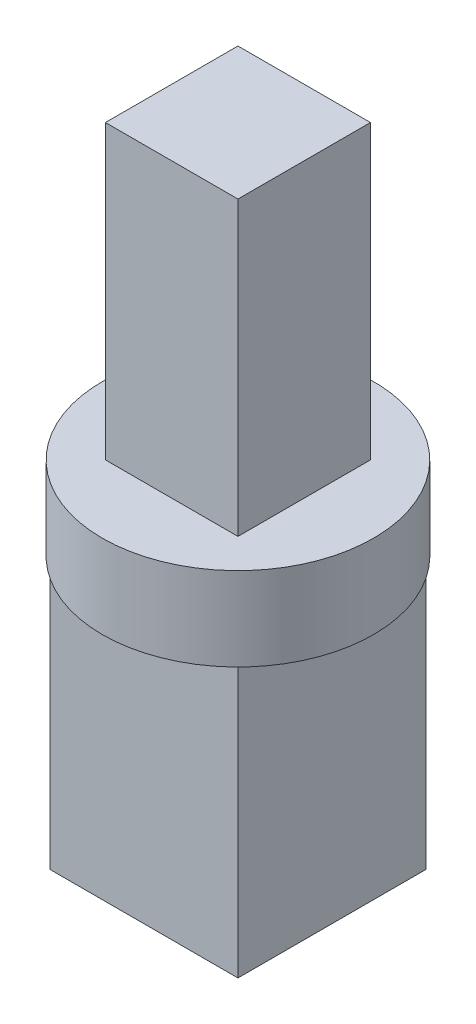
ISO-10303-21;
HEADER;
FILE_DESCRIPTION(('STEP AP214'),'2;1');
FILE_NAME('part.step','',(''),(''),'','','');
FILE_SCHEMA(('AUTOMOTIVE_DESIGN { 1 0 10303 214 1 1 1 1 }'));
ENDSEC;
DATA;
#1=APPLICATION_CONTEXT('core data for automotive mechanical design processes');
#2=APPLICATION_PROTOCOL_DEFINITION('international standard','automotive_design',2000,#1);
#3=PRODUCT_CONTEXT('',#1,'mechanical');
#4=PRODUCT('Part','Part','',(#3));
#5=PRODUCT_RELATED_PRODUCT_CATEGORY('part','',(#4));
#6=PRODUCT_DEFINITION_FORMATION('','',#4);
#7=PRODUCT_DEFINITION_CONTEXT('part definition',#1,'design');
#8=PRODUCT_DEFINITION('design','',#6,#7);
#9=PRODUCT_DEFINITION_SHAPE('','',#8);
#10=(LENGTH_UNIT() NAMED_UNIT(*) SI_UNIT(.MILLI.,.METRE.));
#11=(NAMED_UNIT(*) PLANE_ANGLE_UNIT() SI_UNIT($,.RADIAN.));
#12=(NAMED_UNIT(*) SI_UNIT($,.STERADIAN.) SOLID_ANGLE_UNIT());
#13=UNCERTAINTY_MEASURE_WITH_UNIT(LENGTH_MEASURE(1.E-05),#10,'distance_accuracy_value','');
#14=(GEOMETRIC_REPRESENTATION_CONTEXT(3) GLOBAL_UNCERTAINTY_ASSIGNED_CONTEXT((#13)) GLOBAL_UNIT_ASSIGNED_CONTEXT((#10,
#11,#12)) REPRESENTATION_CONTEXT('',''));
#15=CARTESIAN_POINT('',(0.,0.,0.));
#16=DIRECTION('',(0.,0.,1.));
#17=DIRECTION('',(1.,0.,0.));
#18=AXIS2_PLACEMENT_3D('',#15,#16,#17);
#19=CARTESIAN_POINT('',(0.,0.,0.));
#20=DIRECTION('',(0.,1.,0.));
#21=DIRECTION('',(0.,0.,1.));
#22=AXIS2_PLACEMENT_3D('',#19,#20,#21);
#23=PLANE('',#22);
#24=CARTESIAN_POINT('',(0.,0.,0.));
#25=DIRECTION('',(0.,1.,0.));
#26=DIRECTION('',(0.,0.,1.));
#27=AXIS2_PLACEMENT_3D('',#24,#25,#26);
#28=CIRCLE('',#27,6.5);
#29=CARTESIAN_POINT('',(0.,0.,6.5));
#30=VERTEX_POINT('',#29);
#31=EDGE_CURVE('E43',#30,#30,#28,.T.);
#32=ORIENTED_EDGE('',*,*,#31,.F.);
#33=EDGE_LOOP('',(#32));
#34=FACE_BOUND('',#33,.T.);
#35=DIRECTION('',(0.,0.,1.));
#36=VECTOR('',#35,1.);
#37=CARTESIAN_POINT('',(4.5,0.,-4.5));
#38=LINE('',#37,#36);
#39=CARTESIAN_POINT('',(4.5,0.,-4.5));
#40=VERTEX_POINT('',#39);
#41=CARTESIAN_POINT('',(4.5,0.,4.5));
#42=VERTEX_POINT('',#41);
#43=EDGE_CURVE('E54',#40,#42,#38,.T.);
#44=ORIENTED_EDGE('',*,*,#43,.F.);
#45=DIRECTION('',(1.,0.,0.));
#46=VECTOR('',#45,1.);
#47=CARTESIAN_POINT('',(-4.5,0.,-4.5));
#48=LINE('',#47,#46);
#49=CARTESIAN_POINT('',(-4.5,0.,-4.5));
#50=VERTEX_POINT('',#49);
#51=EDGE_CURVE('E58',#50,#40,#48,.T.);
#52=ORIENTED_EDGE('',*,*,#51,.F.);
#53=DIRECTION('',(0.,0.,-1.));
#54=VECTOR('',#53,1.);
#55=CARTESIAN_POINT('',(-4.5,0.,-4.5));
#56=LINE('',#55,#54);
#57=CARTESIAN_POINT('',(-4.5,0.,4.5));
#58=VERTEX_POINT('',#57);
#59=EDGE_CURVE('E288',#58,#50,#56,.T.);
#60=ORIENTED_EDGE('',*,*,#59,.F.);
#61=DIRECTION('',(-1.,0.,0.));
#62=VECTOR('',#61,1.);
#63=CARTESIAN_POINT('',(-4.5,0.,4.5));
#64=LINE('',#63,#62);
#65=EDGE_CURVE('E294',#42,#58,#64,.T.);
#66=ORIENTED_EDGE('',*,*,#65,.F.);
#67=EDGE_LOOP('',(#44,#52,#60,#66));
#68=FACE_BOUND('',#67,.T.);
#69=ADVANCED_FACE('F39',(#34,#68),#23,.F.);
#70=CARTESIAN_POINT('',(0.,4.,0.));
#71=DIRECTION('',(0.,-1.,0.));
#72=DIRECTION('',(0.,0.,-1.));
#73=AXIS2_PLACEMENT_3D('',#70,#71,#72);
#74=CYLINDRICAL_SURFACE('',#73,6.5);
#75=CARTESIAN_POINT('',(0.,4.,0.));
#76=DIRECTION('',(0.,1.,0.));
#77=DIRECTION('',(0.,0.,1.));
#78=AXIS2_PLACEMENT_3D('',#75,#76,#77);
#79=CIRCLE('',#78,6.5);
#80=CARTESIAN_POINT('',(0.,4.,6.5));
#81=VERTEX_POINT('',#80);
#82=EDGE_CURVE('E11',#81,#81,#79,.T.);
#83=ORIENTED_EDGE('',*,*,#82,.F.);
#84=EDGE_LOOP('',(#83));
#85=FACE_BOUND('',#84,.T.);
#86=ORIENTED_EDGE('',*,*,#31,.T.);
#87=EDGE_LOOP('',(#86));
#88=FACE_BOUND('',#87,.T.);
#89=ADVANCED_FACE('F41',(#85,#88),#74,.T.);
#90=CARTESIAN_POINT('',(0.,4.,0.));
#91=DIRECTION('',(0.,1.,0.));
#92=DIRECTION('',(0.,0.,1.));
#93=AXIS2_PLACEMENT_3D('',#90,#91,#92);
#94=PLANE('',#93);
#95=DIRECTION('',(0.,0.,-1.));
#96=VECTOR('',#95,1.);
#97=CARTESIAN_POINT('',(3.175,4.,3.175));
#98=LINE('',#97,#96);
#99=CARTESIAN_POINT('',(3.175,4.,3.175));
#100=VERTEX_POINT('',#99);
#101=CARTESIAN_POINT('',(3.175,4.,-3.175));
#102=VERTEX_POINT('',#101);
#103=EDGE_CURVE('E124',#100,#102,#98,.T.);
#104=ORIENTED_EDGE('',*,*,#103,.F.);
#105=DIRECTION('',(1.,0.,0.));
#106=VECTOR('',#105,1.);
#107=CARTESIAN_POINT('',(-3.175,4.,3.175));
#108=LINE('',#107,#106);
#109=CARTESIAN_POINT('',(-3.175,4.,3.175));
#110=VERTEX_POINT('',#109);
#111=EDGE_CURVE('E137',#110,#100,#108,.T.);
#112=ORIENTED_EDGE('',*,*,#111,.F.);
#113=DIRECTION('',(0.,0.,1.));
#114=VECTOR('',#113,1.);
#115=CARTESIAN_POINT('',(-3.175,4.,3.175));
#116=LINE('',#115,#114);
#117=CARTESIAN_POINT('',(-3.175,4.,-3.175));
#118=VERTEX_POINT('',#117);
#119=EDGE_CURVE('E146',#118,#110,#116,.T.);
#120=ORIENTED_EDGE('',*,*,#119,.F.);
#121=DIRECTION('',(-1.,0.,0.));
#122=VECTOR('',#121,1.);
#123=CARTESIAN_POINT('',(-3.175,4.,-3.175));
#124=LINE('',#123,#122);
#125=EDGE_CURVE('E127',#102,#118,#124,.T.);
#126=ORIENTED_EDGE('',*,*,#125,.F.);
#127=EDGE_LOOP('',(#104,#112,#120,#126));
#128=FACE_BOUND('',#127,.T.);
#129=ORIENTED_EDGE('',*,*,#82,.T.);
#130=EDGE_LOOP('',(#129));
#131=FACE_BOUND('',#130,.T.);
#132=ADVANCED_FACE('F173',(#128,#131),#94,.T.);
#133=CARTESIAN_POINT('',(3.175,18.,3.175));
#134=DIRECTION('',(-1.,0.,0.));
#135=DIRECTION('',(0.,0.,1.));
#136=AXIS2_PLACEMENT_3D('',#133,#134,#135);
#137=PLANE('',#136);
#138=ORIENTED_EDGE('',*,*,#103,.T.);
#139=DIRECTION('',(0.,-1.,0.));
#140=VECTOR('',#139,1.);
#141=CARTESIAN_POINT('',(3.175,18.,-3.175));
#142=LINE('',#141,#140);
#143=CARTESIAN_POINT('',(3.175,18.,-3.175));
#144=VERTEX_POINT('',#143);
#145=EDGE_CURVE('E159',#144,#102,#142,.T.);
#146=ORIENTED_EDGE('',*,*,#145,.F.);
#147=DIRECTION('',(0.,0.,-1.));
#148=VECTOR('',#147,1.);
#149=CARTESIAN_POINT('',(3.175,18.,3.175));
#150=LINE('',#149,#148);
#151=CARTESIAN_POINT('',(3.175,18.,3.175));
#152=VERTEX_POINT('',#151);
#153=EDGE_CURVE('E133',#152,#144,#150,.T.);
#154=ORIENTED_EDGE('',*,*,#153,.F.);
#155=DIRECTION('',(0.,-1.,0.));
#156=VECTOR('',#155,1.);
#157=CARTESIAN_POINT('',(3.175,18.,3.175));
#158=LINE('',#157,#156);
#159=EDGE_CURVE('E142',#152,#100,#158,.T.);
#160=ORIENTED_EDGE('',*,*,#159,.T.);
#161=EDGE_LOOP('',(#138,#146,#154,#160));
#162=FACE_BOUND('',#161,.T.);
#163=ADVANCED_FACE('F178',(#162),#137,.F.);
#164=CARTESIAN_POINT('',(-3.175,18.,-3.175));
#165=DIRECTION('',(0.,0.,1.));
#166=DIRECTION('',(1.,0.,0.));
#167=AXIS2_PLACEMENT_3D('',#164,#165,#166);
#168=PLANE('',#167);
#169=ORIENTED_EDGE('',*,*,#125,.T.);
#170=DIRECTION('',(0.,-1.,0.));
#171=VECTOR('',#170,1.);
#172=CARTESIAN_POINT('',(-3.175,18.,-3.175));
#173=LINE('',#172,#171);
#174=CARTESIAN_POINT('',(-3.175,18.,-3.175));
#175=VERTEX_POINT('',#174);
#176=EDGE_CURVE('E156',#175,#118,#173,.T.);
#177=ORIENTED_EDGE('',*,*,#176,.F.);
#178=DIRECTION('',(-1.,0.,0.));
#179=VECTOR('',#178,1.);
#180=CARTESIAN_POINT('',(-3.175,18.,-3.175));
#181=LINE('',#180,#179);
#182=EDGE_CURVE('E136',#144,#175,#181,.T.);
#183=ORIENTED_EDGE('',*,*,#182,.F.);
#184=ORIENTED_EDGE('',*,*,#145,.T.);
#185=EDGE_LOOP('',(#169,#177,#183,#184));
#186=FACE_BOUND('',#185,.T.);
#187=ADVANCED_FACE('F182',(#186),#168,.F.);
#188=CARTESIAN_POINT('',(-3.175,18.,3.175));
#189=DIRECTION('',(1.,0.,0.));
#190=DIRECTION('',(0.,0.,-1.));
#191=AXIS2_PLACEMENT_3D('',#188,#189,#190);
#192=PLANE('',#191);
#193=ORIENTED_EDGE('',*,*,#119,.T.);
#194=DIRECTION('',(0.,-1.,0.));
#195=VECTOR('',#194,1.);
#196=CARTESIAN_POINT('',(-3.175,18.,3.175));
#197=LINE('',#196,#195);
#198=CARTESIAN_POINT('',(-3.175,18.,3.175));
#199=VERTEX_POINT('',#198);
#200=EDGE_CURVE('E153',#199,#110,#197,.T.);
#201=ORIENTED_EDGE('',*,*,#200,.F.);
#202=DIRECTION('',(0.,0.,1.));
#203=VECTOR('',#202,1.);
#204=CARTESIAN_POINT('',(-3.175,18.,3.175));
#205=LINE('',#204,#203);
#206=EDGE_CURVE('E139',#175,#199,#205,.T.);
#207=ORIENTED_EDGE('',*,*,#206,.F.);
#208=ORIENTED_EDGE('',*,*,#176,.T.);
#209=EDGE_LOOP('',(#193,#201,#207,#208));
#210=FACE_BOUND('',#209,.T.);
#211=ADVANCED_FACE('F186',(#210),#192,.F.);
#212=CARTESIAN_POINT('',(-3.175,18.,3.175));
#213=DIRECTION('',(0.,0.,-1.));
#214=DIRECTION('',(-1.,0.,0.));
#215=AXIS2_PLACEMENT_3D('',#212,#213,#214);
#216=PLANE('',#215);
#217=ORIENTED_EDGE('',*,*,#111,.T.);
#218=ORIENTED_EDGE('',*,*,#159,.F.);
#219=DIRECTION('',(1.,0.,0.));
#220=VECTOR('',#219,1.);
#221=CARTESIAN_POINT('',(-3.175,18.,3.175));
#222=LINE('',#221,#220);
#223=EDGE_CURVE('E141',#199,#152,#222,.T.);
#224=ORIENTED_EDGE('',*,*,#223,.F.);
#225=ORIENTED_EDGE('',*,*,#200,.T.);
#226=EDGE_LOOP('',(#217,#218,#224,#225));
#227=FACE_BOUND('',#226,.T.);
#228=ADVANCED_FACE('F189',(#227),#216,.F.);
#229=CARTESIAN_POINT('',(0.,18.,0.));
#230=DIRECTION('',(0.,-1.,0.));
#231=DIRECTION('',(0.,0.,-1.));
#232=AXIS2_PLACEMENT_3D('',#229,#230,#231);
#233=PLANE('',#232);
#234=ORIENTED_EDGE('',*,*,#153,.T.);
#235=ORIENTED_EDGE('',*,*,#182,.T.);
#236=ORIENTED_EDGE('',*,*,#206,.T.);
#237=ORIENTED_EDGE('',*,*,#223,.T.);
#238=EDGE_LOOP('',(#234,#235,#236,#237));
#239=FACE_BOUND('',#238,.T.);
#240=ADVANCED_FACE('F193',(#239),#233,.F.);
#241=CARTESIAN_POINT('',(4.5,-13.,-4.5));
#242=DIRECTION('',(-1.,0.,0.));
#243=DIRECTION('',(0.,0.,1.));
#244=AXIS2_PLACEMENT_3D('',#241,#242,#243);
#245=PLANE('',#244);
#246=ORIENTED_EDGE('',*,*,#43,.T.);
#247=DIRECTION('',(0.,1.,0.));
#248=VECTOR('',#247,1.);
#249=CARTESIAN_POINT('',(4.5,-13.,4.5));
#250=LINE('',#249,#248);
#251=CARTESIAN_POINT('',(4.5,-13.,4.5));
#252=VERTEX_POINT('',#251);
#253=EDGE_CURVE('E107',#252,#42,#250,.T.);
#254=ORIENTED_EDGE('',*,*,#253,.F.);
#255=DIRECTION('',(0.,0.,1.));
#256=VECTOR('',#255,1.);
#257=CARTESIAN_POINT('',(4.5,-13.,-4.5));
#258=LINE('',#257,#256);
#259=CARTESIAN_POINT('',(4.5,-13.,-4.5));
#260=VERTEX_POINT('',#259);
#261=EDGE_CURVE('E113',#260,#252,#258,.T.);
#262=ORIENTED_EDGE('',*,*,#261,.F.);
#263=DIRECTION('',(0.,1.,0.));
#264=VECTOR('',#263,1.);
#265=CARTESIAN_POINT('',(4.5,-13.,-4.5));
#266=LINE('',#265,#264);
#267=EDGE_CURVE('E286',#260,#40,#266,.T.);
#268=ORIENTED_EDGE('',*,*,#267,.T.);
#269=EDGE_LOOP('',(#246,#254,#262,#268));
#270=FACE_BOUND('',#269,.T.);
#271=ADVANCED_FACE('F123',(#270),#245,.F.);
#272=CARTESIAN_POINT('',(-4.5,-13.,4.5));
#273=DIRECTION('',(0.,0.,-1.));
#274=DIRECTION('',(-1.,0.,0.));
#275=AXIS2_PLACEMENT_3D('',#272,#273,#274);
#276=PLANE('',#275);
#277=ORIENTED_EDGE('',*,*,#65,.T.);
#278=DIRECTION('',(0.,1.,0.));
#279=VECTOR('',#278,1.);
#280=CARTESIAN_POINT('',(-4.5,-13.,4.5));
#281=LINE('',#280,#279);
#282=CARTESIAN_POINT('',(-4.5,-13.,4.5));
#283=VERTEX_POINT('',#282);
#284=EDGE_CURVE('E109',#283,#58,#281,.T.);
#285=ORIENTED_EDGE('',*,*,#284,.F.);
#286=DIRECTION('',(-1.,0.,0.));
#287=VECTOR('',#286,1.);
#288=CARTESIAN_POINT('',(-4.5,-13.,4.5));
#289=LINE('',#288,#287);
#290=EDGE_CURVE('E102',#252,#283,#289,.T.);
#291=ORIENTED_EDGE('',*,*,#290,.F.);
#292=ORIENTED_EDGE('',*,*,#253,.T.);
#293=EDGE_LOOP('',(#277,#285,#291,#292));
#294=FACE_BOUND('',#293,.T.);
#295=ADVANCED_FACE('F105',(#294),#276,.F.);
#296=CARTESIAN_POINT('',(-4.5,-13.,-4.5));
#297=DIRECTION('',(1.,0.,0.));
#298=DIRECTION('',(0.,0.,-1.));
#299=AXIS2_PLACEMENT_3D('',#296,#297,#298);
#300=PLANE('',#299);
#301=ORIENTED_EDGE('',*,*,#59,.T.);
#302=DIRECTION('',(0.,1.,0.));
#303=VECTOR('',#302,1.);
#304=CARTESIAN_POINT('',(-4.5,-13.,-4.5));
#305=LINE('',#304,#303);
#306=CARTESIAN_POINT('',(-4.5,-13.,-4.5));
#307=VERTEX_POINT('',#306);
#308=EDGE_CURVE('E129',#307,#50,#305,.T.);
#309=ORIENTED_EDGE('',*,*,#308,.F.);
#310=DIRECTION('',(0.,0.,-1.));
#311=VECTOR('',#310,1.);
#312=CARTESIAN_POINT('',(-4.5,-13.,-4.5));
#313=LINE('',#312,#311);
#314=EDGE_CURVE('E112',#283,#307,#313,.T.);
#315=ORIENTED_EDGE('',*,*,#314,.F.);
#316=ORIENTED_EDGE('',*,*,#284,.T.);
#317=EDGE_LOOP('',(#301,#309,#315,#316));
#318=FACE_BOUND('',#317,.T.);
#319=ADVANCED_FACE('F200',(#318),#300,.F.);
#320=CARTESIAN_POINT('',(-4.5,-13.,-4.5));
#321=DIRECTION('',(0.,0.,1.));
#322=DIRECTION('',(1.,0.,0.));
#323=AXIS2_PLACEMENT_3D('',#320,#321,#322);
#324=PLANE('',#323);
#325=ORIENTED_EDGE('',*,*,#51,.T.);
#326=ORIENTED_EDGE('',*,*,#267,.F.);
#327=DIRECTION('',(1.,0.,0.));
#328=VECTOR('',#327,1.);
#329=CARTESIAN_POINT('',(-4.5,-13.,-4.5));
#330=LINE('',#329,#328);
#331=EDGE_CURVE('E118',#307,#260,#330,.T.);
#332=ORIENTED_EDGE('',*,*,#331,.F.);
#333=ORIENTED_EDGE('',*,*,#308,.T.);
#334=EDGE_LOOP('',(#325,#326,#332,#333));
#335=FACE_BOUND('',#334,.T.);
#336=ADVANCED_FACE('F203',(#335),#324,.F.);
#337=CARTESIAN_POINT('',(0.,-13.,0.));
#338=DIRECTION('',(0.,1.,0.));
#339=DIRECTION('',(0.,0.,1.));
#340=AXIS2_PLACEMENT_3D('',#337,#338,#339);
#341=PLANE('',#340);
#342=ORIENTED_EDGE('',*,*,#261,.T.);
#343=ORIENTED_EDGE('',*,*,#290,.T.);
#344=ORIENTED_EDGE('',*,*,#314,.T.);
#345=ORIENTED_EDGE('',*,*,#331,.T.);
#346=EDGE_LOOP('',(#342,#343,#344,#345));
#347=FACE_BOUND('',#346,.T.);
#348=ADVANCED_FACE('F116',(#347),#341,.F.);
#349=CLOSED_SHELL('',(#69,#89,#132,#163,#187,#211,#228,#240,#271,#295,#319,#336,#348));
#350=MANIFOLD_SOLID_BREP('B2',#349);
#351=ADVANCED_BREP_SHAPE_REPRESENTATION('',(#18,#350),#14);
#352=SHAPE_DEFINITION_REPRESENTATION(#9,#351);
ENDSEC;
END-ISO-10303-21;
